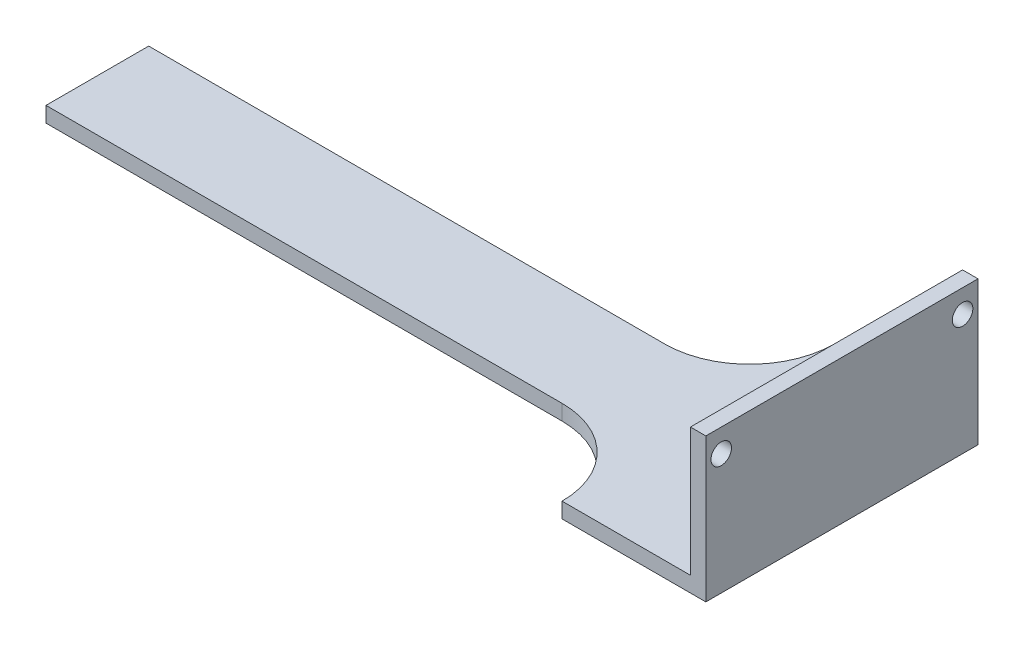
ISO-10303-21;
HEADER;
FILE_DESCRIPTION(('STEP AP214'),'2;1');
FILE_NAME('part.step','',(''),(''),'','','');
FILE_SCHEMA(('AUTOMOTIVE_DESIGN { 1 0 10303 214 1 1 1 1 }'));
ENDSEC;
DATA;
#1=APPLICATION_CONTEXT('core data for automotive mechanical design processes');
#2=APPLICATION_PROTOCOL_DEFINITION('international standard','automotive_design',2000,#1);
#3=PRODUCT_CONTEXT('',#1,'mechanical');
#4=PRODUCT('Part','Part','',(#3));
#5=PRODUCT_RELATED_PRODUCT_CATEGORY('part','',(#4));
#6=PRODUCT_DEFINITION_FORMATION('','',#4);
#7=PRODUCT_DEFINITION_CONTEXT('part definition',#1,'design');
#8=PRODUCT_DEFINITION('design','',#6,#7);
#9=PRODUCT_DEFINITION_SHAPE('','',#8);
#10=(LENGTH_UNIT() NAMED_UNIT(*) SI_UNIT(.MILLI.,.METRE.));
#11=(NAMED_UNIT(*) PLANE_ANGLE_UNIT() SI_UNIT($,.RADIAN.));
#12=(NAMED_UNIT(*) SI_UNIT($,.STERADIAN.) SOLID_ANGLE_UNIT());
#13=UNCERTAINTY_MEASURE_WITH_UNIT(LENGTH_MEASURE(1.E-05),#10,'distance_accuracy_value','');
#14=(GEOMETRIC_REPRESENTATION_CONTEXT(3) GLOBAL_UNCERTAINTY_ASSIGNED_CONTEXT((#13)) GLOBAL_UNIT_ASSIGNED_CONTEXT((#10,
#11,#12)) REPRESENTATION_CONTEXT('',''));
#15=CARTESIAN_POINT('',(0.,0.,0.));
#16=DIRECTION('',(0.,0.,1.));
#17=DIRECTION('',(1.,0.,0.));
#18=AXIS2_PLACEMENT_3D('',#15,#16,#17);
#19=CARTESIAN_POINT('',(117.,3.,-53.));
#20=DIRECTION('',(0.,0.,1.));
#21=DIRECTION('',(1.,0.,0.));
#22=AXIS2_PLACEMENT_3D('',#19,#20,#21);
#23=PLANE('',#22);
#24=DIRECTION('',(-1.,0.,0.));
#25=VECTOR('',#24,1.);
#26=CARTESIAN_POINT('',(117.,0.,-53.));
#27=LINE('',#26,#25);
#28=CARTESIAN_POINT('',(145.,0.,-53.));
#29=VERTEX_POINT('',#28);
#30=CARTESIAN_POINT('',(117.,0.,-53.));
#31=VERTEX_POINT('',#30);
#32=EDGE_CURVE('E131',#29,#31,#27,.T.);
#33=ORIENTED_EDGE('',*,*,#32,.T.);
#34=DIRECTION('',(0.,-1.,0.));
#35=VECTOR('',#34,1.);
#36=CARTESIAN_POINT('',(117.,3.,-53.));
#37=LINE('',#36,#35);
#38=CARTESIAN_POINT('',(117.,3.,-53.));
#39=VERTEX_POINT('',#38);
#40=EDGE_CURVE('E11',#39,#31,#37,.T.);
#41=ORIENTED_EDGE('',*,*,#40,.F.);
#42=DIRECTION('',(-1.,0.,0.));
#43=VECTOR('',#42,1.);
#44=CARTESIAN_POINT('',(117.,3.,-53.));
#45=LINE('',#44,#43);
#46=CARTESIAN_POINT('',(142.,3.,-53.));
#47=VERTEX_POINT('',#46);
#48=EDGE_CURVE('E151',#47,#39,#45,.T.);
#49=ORIENTED_EDGE('',*,*,#48,.F.);
#50=DIRECTION('',(0.,1.,0.));
#51=VECTOR('',#50,1.);
#52=CARTESIAN_POINT('',(142.,0.,-53.));
#53=LINE('',#52,#51);
#54=CARTESIAN_POINT('',(142.,28.,-53.));
#55=VERTEX_POINT('',#54);
#56=EDGE_CURVE('E92',#47,#55,#53,.T.);
#57=ORIENTED_EDGE('',*,*,#56,.T.);
#58=DIRECTION('',(-1.,0.,0.));
#59=VECTOR('',#58,1.);
#60=CARTESIAN_POINT('',(145.,28.,-53.));
#61=LINE('',#60,#59);
#62=CARTESIAN_POINT('',(145.,28.,-53.));
#63=VERTEX_POINT('',#62);
#64=EDGE_CURVE('E134',#63,#55,#61,.T.);
#65=ORIENTED_EDGE('',*,*,#64,.F.);
#66=DIRECTION('',(0.,1.,0.));
#67=VECTOR('',#66,1.);
#68=CARTESIAN_POINT('',(145.,0.,-53.));
#69=LINE('',#68,#67);
#70=EDGE_CURVE('E224',#29,#63,#69,.T.);
#71=ORIENTED_EDGE('',*,*,#70,.F.);
#72=EDGE_LOOP('',(#33,#41,#49,#57,#65,#71));
#73=FACE_BOUND('',#72,.T.);
#74=ADVANCED_FACE('F35',(#73),#23,.F.);
#75=CARTESIAN_POINT('',(100.5,3.,-53.));
#76=DIRECTION('',(0.,-1.,0.));
#77=DIRECTION('',(0.,0.,-1.));
#78=AXIS2_PLACEMENT_3D('',#75,#76,#77);
#79=CYLINDRICAL_SURFACE('',#78,16.5);
#80=CARTESIAN_POINT('',(100.5,0.,-53.));
#81=DIRECTION('',(0.,-1.,0.));
#82=DIRECTION('',(0.,0.,1.));
#83=AXIS2_PLACEMENT_3D('',#80,#81,#82);
#84=CIRCLE('',#83,16.5);
#85=CARTESIAN_POINT('',(100.5,0.,-36.5));
#86=VERTEX_POINT('',#85);
#87=EDGE_CURVE('E133',#31,#86,#84,.T.);
#88=ORIENTED_EDGE('',*,*,#87,.T.);
#89=DIRECTION('',(0.,-1.,0.));
#90=VECTOR('',#89,1.);
#91=CARTESIAN_POINT('',(100.5,3.,-36.5));
#92=LINE('',#91,#90);
#93=CARTESIAN_POINT('',(100.5,3.,-36.5));
#94=VERTEX_POINT('',#93);
#95=EDGE_CURVE('E44',#94,#86,#92,.T.);
#96=ORIENTED_EDGE('',*,*,#95,.F.);
#97=CARTESIAN_POINT('',(100.5,3.,-53.));
#98=DIRECTION('',(0.,-1.,0.));
#99=DIRECTION('',(0.,0.,1.));
#100=AXIS2_PLACEMENT_3D('',#97,#98,#99);
#101=CIRCLE('',#100,16.5);
#102=EDGE_CURVE('E153',#39,#94,#101,.T.);
#103=ORIENTED_EDGE('',*,*,#102,.F.);
#104=ORIENTED_EDGE('',*,*,#40,.T.);
#105=EDGE_LOOP('',(#88,#96,#103,#104));
#106=FACE_BOUND('',#105,.T.);
#107=ADVANCED_FACE('F166',(#106),#79,.F.);
#108=CARTESIAN_POINT('',(0.,3.,-36.5));
#109=DIRECTION('',(0.,0.,1.));
#110=DIRECTION('',(1.,0.,0.));
#111=AXIS2_PLACEMENT_3D('',#108,#109,#110);
#112=PLANE('',#111);
#113=DIRECTION('',(-1.,0.,0.));
#114=VECTOR('',#113,1.);
#115=CARTESIAN_POINT('',(0.,0.,-36.5));
#116=LINE('',#115,#114);
#117=CARTESIAN_POINT('',(0.,0.,-36.5));
#118=VERTEX_POINT('',#117);
#119=EDGE_CURVE('E136',#86,#118,#116,.T.);
#120=ORIENTED_EDGE('',*,*,#119,.T.);
#121=DIRECTION('',(0.,-1.,0.));
#122=VECTOR('',#121,1.);
#123=CARTESIAN_POINT('',(0.,3.,-36.5));
#124=LINE('',#123,#122);
#125=CARTESIAN_POINT('',(0.,3.,-36.5));
#126=VERTEX_POINT('',#125);
#127=EDGE_CURVE('E122',#126,#118,#124,.T.);
#128=ORIENTED_EDGE('',*,*,#127,.F.);
#129=DIRECTION('',(-1.,0.,0.));
#130=VECTOR('',#129,1.);
#131=CARTESIAN_POINT('',(0.,3.,-36.5));
#132=LINE('',#131,#130);
#133=EDGE_CURVE('E113',#94,#126,#132,.T.);
#134=ORIENTED_EDGE('',*,*,#133,.F.);
#135=ORIENTED_EDGE('',*,*,#95,.T.);
#136=EDGE_LOOP('',(#120,#128,#134,#135));
#137=FACE_BOUND('',#136,.T.);
#138=ADVANCED_FACE('F170',(#137),#112,.F.);
#139=CARTESIAN_POINT('',(0.,3.,-16.5));
#140=DIRECTION('',(1.,0.,0.));
#141=DIRECTION('',(0.,0.,-1.));
#142=AXIS2_PLACEMENT_3D('',#139,#140,#141);
#143=PLANE('',#142);
#144=DIRECTION('',(0.,0.,1.));
#145=VECTOR('',#144,1.);
#146=CARTESIAN_POINT('',(0.,0.,-16.5));
#147=LINE('',#146,#145);
#148=CARTESIAN_POINT('',(0.,0.,-16.5));
#149=VERTEX_POINT('',#148);
#150=EDGE_CURVE('E121',#118,#149,#147,.T.);
#151=ORIENTED_EDGE('',*,*,#150,.T.);
#152=DIRECTION('',(0.,-1.,0.));
#153=VECTOR('',#152,1.);
#154=CARTESIAN_POINT('',(0.,3.,-16.5));
#155=LINE('',#154,#153);
#156=CARTESIAN_POINT('',(0.,3.,-16.5));
#157=VERTEX_POINT('',#156);
#158=EDGE_CURVE('E118',#157,#149,#155,.T.);
#159=ORIENTED_EDGE('',*,*,#158,.F.);
#160=DIRECTION('',(0.,0.,1.));
#161=VECTOR('',#160,1.);
#162=CARTESIAN_POINT('',(0.,3.,-16.5));
#163=LINE('',#162,#161);
#164=EDGE_CURVE('E106',#126,#157,#163,.T.);
#165=ORIENTED_EDGE('',*,*,#164,.F.);
#166=ORIENTED_EDGE('',*,*,#127,.T.);
#167=EDGE_LOOP('',(#151,#159,#165,#166));
#168=FACE_BOUND('',#167,.T.);
#169=ADVANCED_FACE('F119',(#168),#143,.F.);
#170=CARTESIAN_POINT('',(0.,3.,-16.5));
#171=DIRECTION('',(0.,0.,-1.));
#172=DIRECTION('',(-1.,0.,0.));
#173=AXIS2_PLACEMENT_3D('',#170,#171,#172);
#174=PLANE('',#173);
#175=DIRECTION('',(1.,0.,0.));
#176=VECTOR('',#175,1.);
#177=CARTESIAN_POINT('',(0.,0.,-16.5));
#178=LINE('',#177,#176);
#179=CARTESIAN_POINT('',(100.5,0.,-16.5));
#180=VERTEX_POINT('',#179);
#181=EDGE_CURVE('E77',#149,#180,#178,.T.);
#182=ORIENTED_EDGE('',*,*,#181,.T.);
#183=DIRECTION('',(0.,-1.,0.));
#184=VECTOR('',#183,1.);
#185=CARTESIAN_POINT('',(100.5,3.,-16.5));
#186=LINE('',#185,#184);
#187=CARTESIAN_POINT('',(100.5,3.,-16.5));
#188=VERTEX_POINT('',#187);
#189=EDGE_CURVE('E123',#188,#180,#186,.T.);
#190=ORIENTED_EDGE('',*,*,#189,.F.);
#191=DIRECTION('',(1.,0.,0.));
#192=VECTOR('',#191,1.);
#193=CARTESIAN_POINT('',(0.,3.,-16.5));
#194=LINE('',#193,#192);
#195=EDGE_CURVE('E111',#157,#188,#194,.T.);
#196=ORIENTED_EDGE('',*,*,#195,.F.);
#197=ORIENTED_EDGE('',*,*,#158,.T.);
#198=EDGE_LOOP('',(#182,#190,#196,#197));
#199=FACE_BOUND('',#198,.T.);
#200=ADVANCED_FACE('F125',(#199),#174,.F.);
#201=CARTESIAN_POINT('',(100.5,3.,0.));
#202=DIRECTION('',(0.,-1.,0.));
#203=DIRECTION('',(0.,0.,-1.));
#204=AXIS2_PLACEMENT_3D('',#201,#202,#203);
#205=CYLINDRICAL_SURFACE('',#204,16.5);
#206=CARTESIAN_POINT('',(100.5,0.,0.));
#207=DIRECTION('',(0.,-1.,0.));
#208=DIRECTION('',(0.,0.,-1.));
#209=AXIS2_PLACEMENT_3D('',#206,#207,#208);
#210=CIRCLE('',#209,16.5);
#211=CARTESIAN_POINT('',(117.,0.,0.));
#212=VERTEX_POINT('',#211);
#213=EDGE_CURVE('E83',#180,#212,#210,.T.);
#214=ORIENTED_EDGE('',*,*,#213,.T.);
#215=DIRECTION('',(0.,-1.,0.));
#216=VECTOR('',#215,1.);
#217=CARTESIAN_POINT('',(117.,3.,0.));
#218=LINE('',#217,#216);
#219=CARTESIAN_POINT('',(117.,3.,0.));
#220=VERTEX_POINT('',#219);
#221=EDGE_CURVE('E145',#220,#212,#218,.T.);
#222=ORIENTED_EDGE('',*,*,#221,.F.);
#223=CARTESIAN_POINT('',(100.5,3.,0.));
#224=DIRECTION('',(0.,-1.,0.));
#225=DIRECTION('',(0.,0.,-1.));
#226=AXIS2_PLACEMENT_3D('',#223,#224,#225);
#227=CIRCLE('',#226,16.5);
#228=EDGE_CURVE('E53',#188,#220,#227,.T.);
#229=ORIENTED_EDGE('',*,*,#228,.F.);
#230=ORIENTED_EDGE('',*,*,#189,.T.);
#231=EDGE_LOOP('',(#214,#222,#229,#230));
#232=FACE_BOUND('',#231,.T.);
#233=ADVANCED_FACE('F270',(#232),#205,.F.);
#234=CARTESIAN_POINT('',(117.,3.,0.));
#235=DIRECTION('',(0.,0.,-1.));
#236=DIRECTION('',(-1.,0.,0.));
#237=AXIS2_PLACEMENT_3D('',#234,#235,#236);
#238=PLANE('',#237);
#239=DIRECTION('',(1.,0.,0.));
#240=VECTOR('',#239,1.);
#241=CARTESIAN_POINT('',(117.,0.,0.));
#242=LINE('',#241,#240);
#243=CARTESIAN_POINT('',(145.,0.,0.));
#244=VERTEX_POINT('',#243);
#245=EDGE_CURVE('E141',#212,#244,#242,.T.);
#246=ORIENTED_EDGE('',*,*,#245,.T.);
#247=DIRECTION('',(0.,-1.,0.));
#248=VECTOR('',#247,1.);
#249=CARTESIAN_POINT('',(145.,0.,0.));
#250=LINE('',#249,#248);
#251=CARTESIAN_POINT('',(145.,28.,0.));
#252=VERTEX_POINT('',#251);
#253=EDGE_CURVE('E185',#252,#244,#250,.T.);
#254=ORIENTED_EDGE('',*,*,#253,.F.);
#255=DIRECTION('',(-1.,0.,0.));
#256=VECTOR('',#255,1.);
#257=CARTESIAN_POINT('',(145.,28.,0.));
#258=LINE('',#257,#256);
#259=CARTESIAN_POINT('',(142.,28.,0.));
#260=VERTEX_POINT('',#259);
#261=EDGE_CURVE('E210',#252,#260,#258,.T.);
#262=ORIENTED_EDGE('',*,*,#261,.T.);
#263=DIRECTION('',(0.,-1.,0.));
#264=VECTOR('',#263,1.);
#265=CARTESIAN_POINT('',(142.,0.,0.));
#266=LINE('',#265,#264);
#267=CARTESIAN_POINT('',(142.,3.,0.));
#268=VERTEX_POINT('',#267);
#269=EDGE_CURVE('E205',#260,#268,#266,.T.);
#270=ORIENTED_EDGE('',*,*,#269,.T.);
#271=DIRECTION('',(1.,0.,0.));
#272=VECTOR('',#271,1.);
#273=CARTESIAN_POINT('',(117.,3.,0.));
#274=LINE('',#273,#272);
#275=EDGE_CURVE('E127',#220,#268,#274,.T.);
#276=ORIENTED_EDGE('',*,*,#275,.F.);
#277=ORIENTED_EDGE('',*,*,#221,.T.);
#278=EDGE_LOOP('',(#246,#254,#262,#270,#276,#277));
#279=FACE_BOUND('',#278,.T.);
#280=ADVANCED_FACE('F182',(#279),#238,.F.);
#281=CARTESIAN_POINT('',(100.5,3.,-53.));
#282=DIRECTION('',(0.,1.,0.));
#283=DIRECTION('',(0.,0.,1.));
#284=AXIS2_PLACEMENT_3D('',#281,#282,#283);
#285=PLANE('',#284);
#286=DIRECTION('',(0.,0.,-1.));
#287=VECTOR('',#286,1.);
#288=CARTESIAN_POINT('',(142.,3.,0.));
#289=LINE('',#288,#287);
#290=EDGE_CURVE('E144',#268,#47,#289,.T.);
#291=ORIENTED_EDGE('',*,*,#290,.T.);
#292=ORIENTED_EDGE('',*,*,#48,.T.);
#293=ORIENTED_EDGE('',*,*,#102,.T.);
#294=ORIENTED_EDGE('',*,*,#133,.T.);
#295=ORIENTED_EDGE('',*,*,#164,.T.);
#296=ORIENTED_EDGE('',*,*,#195,.T.);
#297=ORIENTED_EDGE('',*,*,#228,.T.);
#298=ORIENTED_EDGE('',*,*,#275,.T.);
#299=EDGE_LOOP('',(#291,#292,#293,#294,#295,#296,#297,#298));
#300=FACE_BOUND('',#299,.T.);
#301=ADVANCED_FACE('F109',(#300),#285,.T.);
#302=CARTESIAN_POINT('',(100.5,0.,-53.));
#303=DIRECTION('',(0.,1.,0.));
#304=DIRECTION('',(0.,0.,1.));
#305=AXIS2_PLACEMENT_3D('',#302,#303,#304);
#306=PLANE('',#305);
#307=ORIENTED_EDGE('',*,*,#32,.F.);
#308=DIRECTION('',(0.,0.,-1.));
#309=VECTOR('',#308,1.);
#310=CARTESIAN_POINT('',(145.,0.,0.));
#311=LINE('',#310,#309);
#312=EDGE_CURVE('E178',#244,#29,#311,.T.);
#313=ORIENTED_EDGE('',*,*,#312,.F.);
#314=ORIENTED_EDGE('',*,*,#245,.F.);
#315=ORIENTED_EDGE('',*,*,#213,.F.);
#316=ORIENTED_EDGE('',*,*,#181,.F.);
#317=ORIENTED_EDGE('',*,*,#150,.F.);
#318=ORIENTED_EDGE('',*,*,#119,.F.);
#319=ORIENTED_EDGE('',*,*,#87,.F.);
#320=EDGE_LOOP('',(#307,#313,#314,#315,#316,#317,#318,#319));
#321=FACE_BOUND('',#320,.T.);
#322=ADVANCED_FACE('F173',(#321),#306,.F.);
#323=CARTESIAN_POINT('',(142.,0.,0.));
#324=DIRECTION('',(-1.,0.,0.));
#325=DIRECTION('',(0.,0.,1.));
#326=AXIS2_PLACEMENT_3D('',#323,#324,#325);
#327=PLANE('',#326);
#328=CARTESIAN_POINT('',(142.,23.5,-3.));
#329=DIRECTION('',(-1.,0.,0.));
#330=DIRECTION('',(0.,0.,1.));
#331=AXIS2_PLACEMENT_3D('',#328,#329,#330);
#332=CIRCLE('',#331,2.);
#333=CARTESIAN_POINT('',(142.,23.5,-1.));
#334=VERTEX_POINT('',#333);
#335=EDGE_CURVE('E232',#334,#334,#332,.T.);
#336=ORIENTED_EDGE('',*,*,#335,.F.);
#337=EDGE_LOOP('',(#336));
#338=FACE_BOUND('',#337,.T.);
#339=CARTESIAN_POINT('',(142.,23.5,-50.));
#340=DIRECTION('',(-1.,0.,0.));
#341=DIRECTION('',(0.,0.,1.));
#342=AXIS2_PLACEMENT_3D('',#339,#340,#341);
#343=CIRCLE('',#342,2.);
#344=CARTESIAN_POINT('',(142.,23.5,-48.));
#345=VERTEX_POINT('',#344);
#346=EDGE_CURVE('E220',#345,#345,#343,.T.);
#347=ORIENTED_EDGE('',*,*,#346,.F.);
#348=EDGE_LOOP('',(#347));
#349=FACE_BOUND('',#348,.T.);
#350=ORIENTED_EDGE('',*,*,#290,.F.);
#351=ORIENTED_EDGE('',*,*,#269,.F.);
#352=DIRECTION('',(0.,0.,1.));
#353=VECTOR('',#352,1.);
#354=CARTESIAN_POINT('',(142.,28.,0.));
#355=LINE('',#354,#353);
#356=EDGE_CURVE('E204',#55,#260,#355,.T.);
#357=ORIENTED_EDGE('',*,*,#356,.F.);
#358=ORIENTED_EDGE('',*,*,#56,.F.);
#359=EDGE_LOOP('',(#350,#351,#357,#358));
#360=FACE_BOUND('',#359,.T.);
#361=ADVANCED_FACE('F213',(#338,#349,#360),#327,.T.);
#362=CARTESIAN_POINT('',(145.,28.,0.));
#363=DIRECTION('',(0.,-1.,0.));
#364=DIRECTION('',(0.,0.,-1.));
#365=AXIS2_PLACEMENT_3D('',#362,#363,#364);
#366=PLANE('',#365);
#367=ORIENTED_EDGE('',*,*,#356,.T.);
#368=ORIENTED_EDGE('',*,*,#261,.F.);
#369=DIRECTION('',(0.,0.,1.));
#370=VECTOR('',#369,1.);
#371=CARTESIAN_POINT('',(145.,28.,0.));
#372=LINE('',#371,#370);
#373=EDGE_CURVE('E209',#63,#252,#372,.T.);
#374=ORIENTED_EDGE('',*,*,#373,.F.);
#375=ORIENTED_EDGE('',*,*,#64,.T.);
#376=EDGE_LOOP('',(#367,#368,#374,#375));
#377=FACE_BOUND('',#376,.T.);
#378=ADVANCED_FACE('F207',(#377),#366,.F.);
#379=CARTESIAN_POINT('',(145.,0.,0.));
#380=DIRECTION('',(-1.,0.,0.));
#381=DIRECTION('',(0.,0.,1.));
#382=AXIS2_PLACEMENT_3D('',#379,#380,#381);
#383=PLANE('',#382);
#384=CARTESIAN_POINT('',(145.,23.5,-3.));
#385=DIRECTION('',(1.,0.,0.));
#386=DIRECTION('',(0.,0.,1.));
#387=AXIS2_PLACEMENT_3D('',#384,#385,#386);
#388=CIRCLE('',#387,2.);
#389=CARTESIAN_POINT('',(145.,23.5,-1.));
#390=VERTEX_POINT('',#389);
#391=EDGE_CURVE('E235',#390,#390,#388,.T.);
#392=ORIENTED_EDGE('',*,*,#391,.F.);
#393=EDGE_LOOP('',(#392));
#394=FACE_BOUND('',#393,.T.);
#395=CARTESIAN_POINT('',(145.,23.5,-50.));
#396=DIRECTION('',(1.,0.,0.));
#397=DIRECTION('',(0.,0.,-1.));
#398=AXIS2_PLACEMENT_3D('',#395,#396,#397);
#399=CIRCLE('',#398,2.);
#400=CARTESIAN_POINT('',(145.,23.5,-52.));
#401=VERTEX_POINT('',#400);
#402=EDGE_CURVE('E229',#401,#401,#399,.T.);
#403=ORIENTED_EDGE('',*,*,#402,.F.);
#404=EDGE_LOOP('',(#403));
#405=FACE_BOUND('',#404,.T.);
#406=ORIENTED_EDGE('',*,*,#253,.T.);
#407=ORIENTED_EDGE('',*,*,#312,.T.);
#408=ORIENTED_EDGE('',*,*,#70,.T.);
#409=ORIENTED_EDGE('',*,*,#373,.T.);
#410=EDGE_LOOP('',(#406,#407,#408,#409));
#411=FACE_BOUND('',#410,.T.);
#412=ADVANCED_FACE('F241',(#394,#405,#411),#383,.F.);
#413=CARTESIAN_POINT('',(0.,23.5,-50.));
#414=DIRECTION('',(1.,0.,0.));
#415=DIRECTION('',(0.,0.,-1.));
#416=AXIS2_PLACEMENT_3D('',#413,#414,#415);
#417=CYLINDRICAL_SURFACE('',#416,2.);
#418=ORIENTED_EDGE('',*,*,#346,.T.);
#419=EDGE_LOOP('',(#418));
#420=FACE_BOUND('',#419,.T.);
#421=ORIENTED_EDGE('',*,*,#402,.T.);
#422=EDGE_LOOP('',(#421));
#423=FACE_BOUND('',#422,.T.);
#424=ADVANCED_FACE('F244',(#420,#423),#417,.F.);
#425=CARTESIAN_POINT('',(0.,23.5,-3.));
#426=DIRECTION('',(1.,0.,0.));
#427=DIRECTION('',(0.,0.,-1.));
#428=AXIS2_PLACEMENT_3D('',#425,#426,#427);
#429=CYLINDRICAL_SURFACE('',#428,2.);
#430=ORIENTED_EDGE('',*,*,#335,.T.);
#431=EDGE_LOOP('',(#430));
#432=FACE_BOUND('',#431,.T.);
#433=ORIENTED_EDGE('',*,*,#391,.T.);
#434=EDGE_LOOP('',(#433));
#435=FACE_BOUND('',#434,.T.);
#436=ADVANCED_FACE('F239',(#432,#435),#429,.F.);
#437=CLOSED_SHELL('',(#74,#107,#138,#169,#200,#233,#280,#301,#322,#361,#378,#412,#424,#436));
#438=MANIFOLD_SOLID_BREP('B2',#437);
#439=ADVANCED_BREP_SHAPE_REPRESENTATION('',(#18,#438),#14);
#440=SHAPE_DEFINITION_REPRESENTATION(#9,#439);
ENDSEC;
END-ISO-10303-21;
